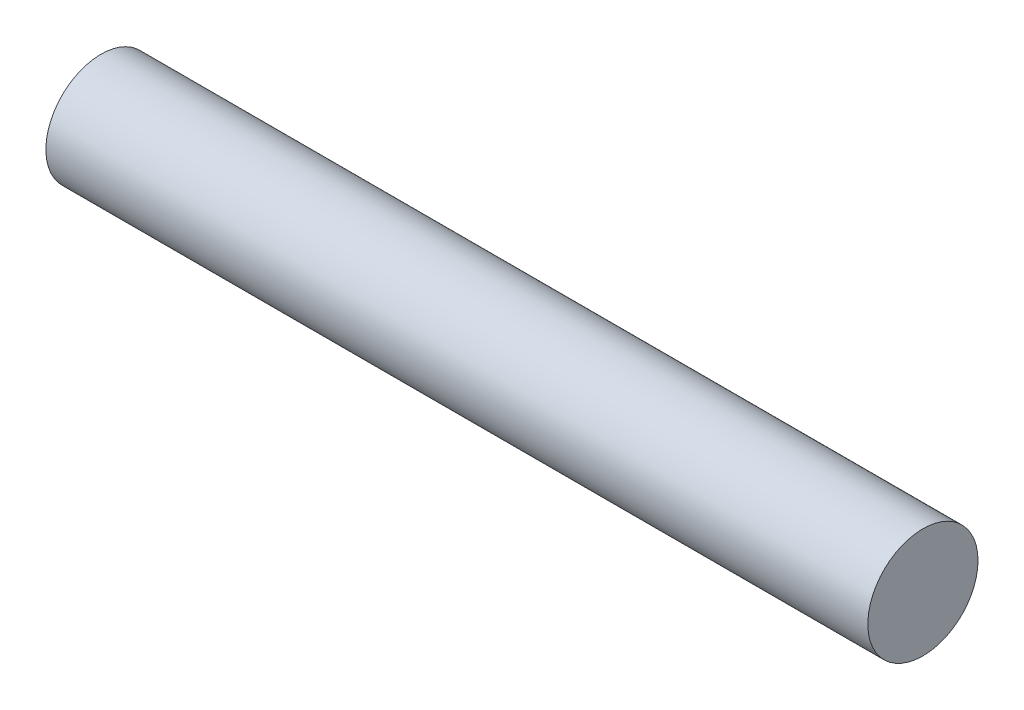
ISO-10303-21;
HEADER;
FILE_DESCRIPTION(('STEP AP214'),'2;1');
FILE_NAME('part.step','',(''),(''),'','','');
FILE_SCHEMA(('AUTOMOTIVE_DESIGN { 1 0 10303 214 1 1 1 1 }'));
ENDSEC;
DATA;
#1=APPLICATION_CONTEXT('core data for automotive mechanical design processes');
#2=APPLICATION_PROTOCOL_DEFINITION('international standard','automotive_design',2000,#1);
#3=PRODUCT_CONTEXT('',#1,'mechanical');
#4=PRODUCT('Part','Part','',(#3));
#5=PRODUCT_RELATED_PRODUCT_CATEGORY('part','',(#4));
#6=PRODUCT_DEFINITION_FORMATION('','',#4);
#7=PRODUCT_DEFINITION_CONTEXT('part definition',#1,'design');
#8=PRODUCT_DEFINITION('design','',#6,#7);
#9=PRODUCT_DEFINITION_SHAPE('','',#8);
#10=(LENGTH_UNIT() NAMED_UNIT(*) SI_UNIT(.MILLI.,.METRE.));
#11=(NAMED_UNIT(*) PLANE_ANGLE_UNIT() SI_UNIT($,.RADIAN.));
#12=(NAMED_UNIT(*) SI_UNIT($,.STERADIAN.) SOLID_ANGLE_UNIT());
#13=UNCERTAINTY_MEASURE_WITH_UNIT(LENGTH_MEASURE(1.E-05),#10,'distance_accuracy_value','');
#14=(GEOMETRIC_REPRESENTATION_CONTEXT(3) GLOBAL_UNCERTAINTY_ASSIGNED_CONTEXT((#13)) GLOBAL_UNIT_ASSIGNED_CONTEXT((#10,
#11,#12)) REPRESENTATION_CONTEXT('',''));
#15=CARTESIAN_POINT('',(0.,0.,0.));
#16=DIRECTION('',(0.,0.,1.));
#17=DIRECTION('',(1.,0.,0.));
#18=AXIS2_PLACEMENT_3D('',#15,#16,#17);
#19=CARTESIAN_POINT('',(-69.0904999879998,97.7500000000001,219.8250001));
#20=DIRECTION('',(1.,0.,0.));
#21=DIRECTION('',(0.,0.,-1.));
#22=AXIS2_PLACEMENT_3D('',#19,#20,#21);
#23=PLANE('',#22);
#24=CARTESIAN_POINT('',(-69.0904999879998,97.7500000000001,219.8250001));
#25=DIRECTION('',(1.,0.,0.));
#26=DIRECTION('',(0.,0.,-1.));
#27=AXIS2_PLACEMENT_3D('',#24,#25,#26);
#28=CIRCLE('',#27,3.17500000000001);
#29=CARTESIAN_POINT('',(-69.0904999879998,97.7500000000001,216.6500001));
#30=VERTEX_POINT('',#29);
#31=EDGE_CURVE('E56',#30,#30,#28,.T.);
#32=ORIENTED_EDGE('',*,*,#31,.F.);
#33=EDGE_LOOP('',(#32));
#34=FACE_BOUND('',#33,.T.);
#35=ADVANCED_FACE('F49',(#34),#23,.F.);
#36=CARTESIAN_POINT('',(-21.7214999959999,97.75,219.825000099999));
#37=DIRECTION('',(1.,0.,0.));
#38=DIRECTION('',(0.,0.,-1.));
#39=AXIS2_PLACEMENT_3D('',#36,#37,#38);
#40=PLANE('',#39);
#41=CARTESIAN_POINT('',(-21.7214999959999,97.75,219.825000099999));
#42=DIRECTION('',(1.,0.,0.));
#43=DIRECTION('',(0.,0.,-1.));
#44=AXIS2_PLACEMENT_3D('',#41,#42,#43);
#45=CIRCLE('',#44,3.17500000000001);
#46=CARTESIAN_POINT('',(-21.7214999959999,97.75,216.650000099999));
#47=VERTEX_POINT('',#46);
#48=EDGE_CURVE('E11',#47,#47,#45,.T.);
#49=ORIENTED_EDGE('',*,*,#48,.T.);
#50=EDGE_LOOP('',(#49));
#51=FACE_BOUND('',#50,.T.);
#52=ADVANCED_FACE('F66',(#51),#40,.T.);
#53=CARTESIAN_POINT('',(-69.0904999879998,97.7500000000001,219.8250001));
#54=DIRECTION('',(1.,0.,0.));
#55=DIRECTION('',(0.,0.,-1.));
#56=AXIS2_PLACEMENT_3D('',#53,#54,#55);
#57=CYLINDRICAL_SURFACE('',#56,3.17500000000001);
#58=ORIENTED_EDGE('',*,*,#48,.F.);
#59=EDGE_LOOP('',(#58));
#60=FACE_BOUND('',#59,.T.);
#61=ORIENTED_EDGE('',*,*,#31,.T.);
#62=EDGE_LOOP('',(#61));
#63=FACE_BOUND('',#62,.T.);
#64=ADVANCED_FACE('F63',(#60,#63),#57,.T.);
#65=CLOSED_SHELL('',(#35,#52,#64));
#66=MANIFOLD_SOLID_BREP('B2',#65);
#67=ADVANCED_BREP_SHAPE_REPRESENTATION('',(#18,#66),#14);
#68=SHAPE_DEFINITION_REPRESENTATION(#9,#67);
ENDSEC;
END-ISO-10303-21;
